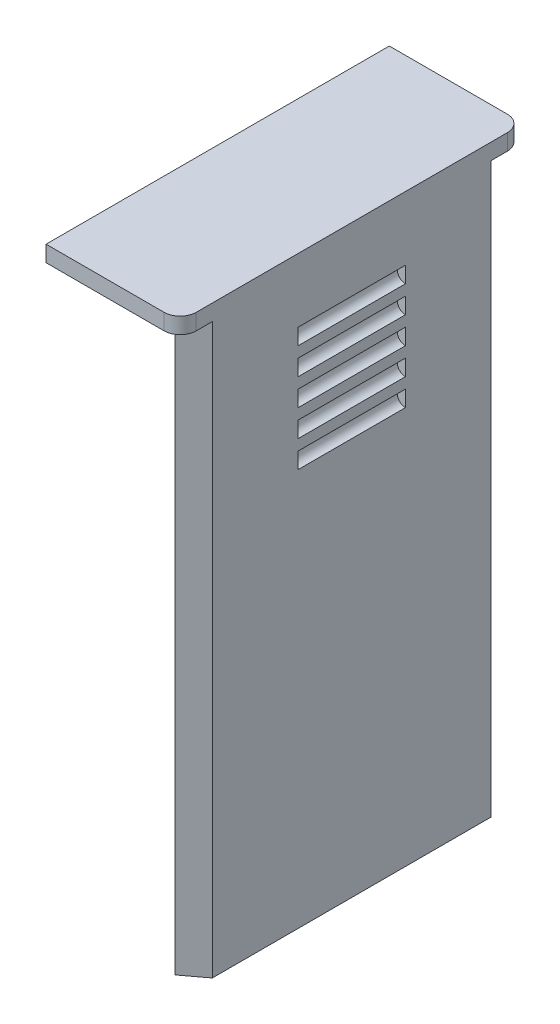
ISO-10303-21;
HEADER;
FILE_DESCRIPTION(('STEP AP214'),'2;1');
FILE_NAME('part.step','',(''),(''),'','','');
FILE_SCHEMA(('AUTOMOTIVE_DESIGN { 1 0 10303 214 1 1 1 1 }'));
ENDSEC;
DATA;
#1=APPLICATION_CONTEXT('core data for automotive mechanical design processes');
#2=APPLICATION_PROTOCOL_DEFINITION('international standard','automotive_design',2000,#1);
#3=PRODUCT_CONTEXT('',#1,'mechanical');
#4=PRODUCT('Part','Part','',(#3));
#5=PRODUCT_RELATED_PRODUCT_CATEGORY('part','',(#4));
#6=PRODUCT_DEFINITION_FORMATION('','',#4);
#7=PRODUCT_DEFINITION_CONTEXT('part definition',#1,'design');
#8=PRODUCT_DEFINITION('design','',#6,#7);
#9=PRODUCT_DEFINITION_SHAPE('','',#8);
#10=(LENGTH_UNIT() NAMED_UNIT(*) SI_UNIT(.MILLI.,.METRE.));
#11=(NAMED_UNIT(*) PLANE_ANGLE_UNIT() SI_UNIT($,.RADIAN.));
#12=(NAMED_UNIT(*) SI_UNIT($,.STERADIAN.) SOLID_ANGLE_UNIT());
#13=UNCERTAINTY_MEASURE_WITH_UNIT(LENGTH_MEASURE(1.E-05),#10,'distance_accuracy_value','');
#14=(GEOMETRIC_REPRESENTATION_CONTEXT(3) GLOBAL_UNCERTAINTY_ASSIGNED_CONTEXT((#13)) GLOBAL_UNIT_ASSIGNED_CONTEXT((#10,
#11,#12)) REPRESENTATION_CONTEXT('',''));
#15=CARTESIAN_POINT('',(0.,0.,0.));
#16=DIRECTION('',(0.,0.,1.));
#17=DIRECTION('',(1.,0.,0.));
#18=AXIS2_PLACEMENT_3D('',#15,#16,#17);
#19=CARTESIAN_POINT('',(-3.45222941321836,109.967949424705,104.41839123638));
#20=DIRECTION('',(1.,0.,0.));
#21=DIRECTION('',(0.,0.,-1.));
#22=AXIS2_PLACEMENT_3D('',#19,#20,#21);
#23=PLANE('',#22);
#24=DIRECTION('',(0.,0.,1.));
#25=VECTOR('',#24,1.);
#26=CARTESIAN_POINT('',(-3.45222941321836,98.017949424705,83.4183912363796));
#27=LINE('',#26,#25);
#28=CARTESIAN_POINT('',(-3.45222941321836,98.017949424705,83.4183912363796));
#29=VERTEX_POINT('',#28);
#30=CARTESIAN_POINT('',(-3.45222941321836,98.017949424705,93.4183912363796));
#31=VERTEX_POINT('',#30);
#32=EDGE_CURVE('E507',#29,#31,#27,.T.);
#33=ORIENTED_EDGE('',*,*,#32,.F.);
#34=DIRECTION('',(0.,-1.,0.));
#35=VECTOR('',#34,1.);
#36=CARTESIAN_POINT('',(-3.45222941321836,109.967949424705,83.4183912363796));
#37=LINE('',#36,#35);
#38=CARTESIAN_POINT('',(-3.45222941321836,96.517949424705,83.4183912363796));
#39=VERTEX_POINT('',#38);
#40=EDGE_CURVE('E205',#29,#39,#37,.T.);
#41=ORIENTED_EDGE('',*,*,#40,.T.);
#42=DIRECTION('',(0.,0.,1.));
#43=VECTOR('',#42,1.);
#44=CARTESIAN_POINT('',(-3.45222941321836,96.517949424705,83.4183912363796));
#45=LINE('',#44,#43);
#46=CARTESIAN_POINT('',(-3.45222941321836,96.517949424705,93.4183912363796));
#47=VERTEX_POINT('',#46);
#48=EDGE_CURVE('E506',#47,#39,#45,.F.);
#49=ORIENTED_EDGE('',*,*,#48,.F.);
#50=DIRECTION('',(0.,-1.,0.));
#51=VECTOR('',#50,1.);
#52=CARTESIAN_POINT('',(-3.45222941321836,109.967949424705,93.4183912363796));
#53=LINE('',#52,#51);
#54=EDGE_CURVE('E511',#31,#47,#53,.T.);
#55=ORIENTED_EDGE('',*,*,#54,.F.);
#56=EDGE_LOOP('',(#33,#41,#49,#55));
#57=FACE_BOUND('',#56,.T.);
#58=DIRECTION('',(0.,0.,1.));
#59=VECTOR('',#58,1.);
#60=CARTESIAN_POINT('',(-3.45222941321836,103.017949424705,83.4183912363796));
#61=LINE('',#60,#59);
#62=CARTESIAN_POINT('',(-3.45222941321836,103.017949424705,83.4183912363796));
#63=VERTEX_POINT('',#62);
#64=CARTESIAN_POINT('',(-3.45222941321836,103.017949424705,93.4183912363796));
#65=VERTEX_POINT('',#64);
#66=EDGE_CURVE('E526',#63,#65,#61,.T.);
#67=ORIENTED_EDGE('',*,*,#66,.F.);
#68=DIRECTION('',(0.,-1.,0.));
#69=VECTOR('',#68,1.);
#70=CARTESIAN_POINT('',(-3.45222941321836,109.967949424705,83.4183912363796));
#71=LINE('',#70,#69);
#72=CARTESIAN_POINT('',(-3.45222941321836,101.517949424705,83.4183912363796));
#73=VERTEX_POINT('',#72);
#74=EDGE_CURVE('E523',#63,#73,#71,.T.);
#75=ORIENTED_EDGE('',*,*,#74,.T.);
#76=DIRECTION('',(0.,0.,1.));
#77=VECTOR('',#76,1.);
#78=CARTESIAN_POINT('',(-3.45222941321836,101.517949424705,83.4183912363796));
#79=LINE('',#78,#77);
#80=CARTESIAN_POINT('',(-3.45222941321836,101.517949424705,93.4183912363796));
#81=VERTEX_POINT('',#80);
#82=EDGE_CURVE('E529',#81,#73,#79,.F.);
#83=ORIENTED_EDGE('',*,*,#82,.F.);
#84=DIRECTION('',(0.,-1.,0.));
#85=VECTOR('',#84,1.);
#86=CARTESIAN_POINT('',(-3.45222941321836,109.967949424705,93.4183912363796));
#87=LINE('',#86,#85);
#88=EDGE_CURVE('E531',#65,#81,#87,.T.);
#89=ORIENTED_EDGE('',*,*,#88,.F.);
#90=EDGE_LOOP('',(#67,#75,#83,#89));
#91=FACE_BOUND('',#90,.T.);
#92=DIRECTION('',(0.,0.,-1.));
#93=VECTOR('',#92,1.);
#94=CARTESIAN_POINT('',(-3.45222941321836,109.967949424705,104.41839123638));
#95=LINE('',#94,#93);
#96=CARTESIAN_POINT('',(-3.45222941321836,109.967949424705,75.4183912363796));
#97=VERTEX_POINT('',#96);
#98=CARTESIAN_POINT('',(-3.45222941321836,109.967949424705,73.9183912363796));
#99=VERTEX_POINT('',#98);
#100=EDGE_CURVE('E226',#97,#99,#95,.T.);
#101=ORIENTED_EDGE('',*,*,#100,.T.);
#102=DIRECTION('',(0.,1.,0.));
#103=VECTOR('',#102,1.);
#104=CARTESIAN_POINT('',(-3.45222941321836,109.967949424705,73.9183912363796));
#105=LINE('',#104,#103);
#106=CARTESIAN_POINT('',(-3.45222941321836,111.467949424705,73.9183912363796));
#107=VERTEX_POINT('',#106);
#108=EDGE_CURVE('E373',#99,#107,#105,.T.);
#109=ORIENTED_EDGE('',*,*,#108,.T.);
#110=DIRECTION('',(0.,0.,-1.));
#111=VECTOR('',#110,1.);
#112=CARTESIAN_POINT('',(-3.45222941321836,111.467949424705,104.41839123638));
#113=LINE('',#112,#111);
#114=CARTESIAN_POINT('',(-3.45222941321836,111.467949424705,102.91839123638));
#115=VERTEX_POINT('',#114);
#116=EDGE_CURVE('E252',#115,#107,#113,.T.);
#117=ORIENTED_EDGE('',*,*,#116,.F.);
#118=DIRECTION('',(0.,1.,0.));
#119=VECTOR('',#118,1.);
#120=CARTESIAN_POINT('',(-3.45222941321836,109.967949424705,102.91839123638));
#121=LINE('',#120,#119);
#122=CARTESIAN_POINT('',(-3.45222941321836,109.967949424705,102.91839123638));
#123=VERTEX_POINT('',#122);
#124=EDGE_CURVE('E221',#115,#123,#121,.F.);
#125=ORIENTED_EDGE('',*,*,#124,.T.);
#126=CARTESIAN_POINT('',(-3.45222941321836,109.967949424705,101.41839123638));
#127=VERTEX_POINT('',#126);
#128=EDGE_CURVE('E222',#123,#127,#95,.T.);
#129=ORIENTED_EDGE('',*,*,#128,.T.);
#130=DIRECTION('',(0.,1.,0.));
#131=VECTOR('',#130,1.);
#132=CARTESIAN_POINT('',(-3.45222941321836,56.967949424705,101.41839123638));
#133=LINE('',#132,#131);
#134=CARTESIAN_POINT('',(-3.45222941321836,56.967949424705,101.41839123638));
#135=VERTEX_POINT('',#134);
#136=EDGE_CURVE('E249',#135,#127,#133,.T.);
#137=ORIENTED_EDGE('',*,*,#136,.F.);
#138=DIRECTION('',(0.,0.,1.));
#139=VECTOR('',#138,1.);
#140=CARTESIAN_POINT('',(-3.45222941321836,56.967949424705,75.4183912363796));
#141=LINE('',#140,#139);
#142=CARTESIAN_POINT('',(-3.45222941321836,56.967949424705,75.4183912363796));
#143=VERTEX_POINT('',#142);
#144=EDGE_CURVE('E259',#143,#135,#141,.T.);
#145=ORIENTED_EDGE('',*,*,#144,.F.);
#146=DIRECTION('',(0.,1.,0.));
#147=VECTOR('',#146,1.);
#148=CARTESIAN_POINT('',(-3.45222941321836,56.967949424705,75.4183912363796));
#149=LINE('',#148,#147);
#150=EDGE_CURVE('E261',#143,#97,#149,.T.);
#151=ORIENTED_EDGE('',*,*,#150,.T.);
#152=EDGE_LOOP('',(#101,#109,#117,#125,#129,#137,#145,#151));
#153=FACE_BOUND('',#152,.T.);
#154=DIRECTION('',(0.,0.,1.));
#155=VECTOR('',#154,1.);
#156=CARTESIAN_POINT('',(-3.45222941321836,105.517949424705,83.4183912363796));
#157=LINE('',#156,#155);
#158=CARTESIAN_POINT('',(-3.45222941321836,105.517949424705,83.4183912363796));
#159=VERTEX_POINT('',#158);
#160=CARTESIAN_POINT('',(-3.45222941321836,105.517949424705,93.4183912363796));
#161=VERTEX_POINT('',#160);
#162=EDGE_CURVE('E536',#159,#161,#157,.T.);
#163=ORIENTED_EDGE('',*,*,#162,.F.);
#164=DIRECTION('',(0.,-1.,0.));
#165=VECTOR('',#164,1.);
#166=CARTESIAN_POINT('',(-3.45222941321836,109.967949424705,83.4183912363796));
#167=LINE('',#166,#165);
#168=CARTESIAN_POINT('',(-3.45222941321836,104.017949424705,83.4183912363796));
#169=VERTEX_POINT('',#168);
#170=EDGE_CURVE('E533',#159,#169,#167,.T.);
#171=ORIENTED_EDGE('',*,*,#170,.T.);
#172=DIRECTION('',(0.,0.,1.));
#173=VECTOR('',#172,1.);
#174=CARTESIAN_POINT('',(-3.45222941321836,104.017949424705,83.4183912363796));
#175=LINE('',#174,#173);
#176=CARTESIAN_POINT('',(-3.45222941321836,104.017949424705,93.4183912363796));
#177=VERTEX_POINT('',#176);
#178=EDGE_CURVE('E405',#177,#169,#175,.F.);
#179=ORIENTED_EDGE('',*,*,#178,.F.);
#180=DIRECTION('',(0.,-1.,0.));
#181=VECTOR('',#180,1.);
#182=CARTESIAN_POINT('',(-3.45222941321836,109.967949424705,93.4183912363796));
#183=LINE('',#182,#181);
#184=EDGE_CURVE('E402',#161,#177,#183,.T.);
#185=ORIENTED_EDGE('',*,*,#184,.F.);
#186=EDGE_LOOP('',(#163,#171,#179,#185));
#187=FACE_BOUND('',#186,.T.);
#188=DIRECTION('',(0.,0.,1.));
#189=VECTOR('',#188,1.);
#190=CARTESIAN_POINT('',(-3.45222941321836,100.517949424705,83.4183912363796));
#191=LINE('',#190,#189);
#192=CARTESIAN_POINT('',(-3.45222941321836,100.517949424705,83.4183912363796));
#193=VERTEX_POINT('',#192);
#194=CARTESIAN_POINT('',(-3.45222941321836,100.517949424705,93.4183912363796));
#195=VERTEX_POINT('',#194);
#196=EDGE_CURVE('E516',#193,#195,#191,.T.);
#197=ORIENTED_EDGE('',*,*,#196,.F.);
#198=DIRECTION('',(0.,-1.,0.));
#199=VECTOR('',#198,1.);
#200=CARTESIAN_POINT('',(-3.45222941321836,109.967949424705,83.4183912363796));
#201=LINE('',#200,#199);
#202=CARTESIAN_POINT('',(-3.45222941321836,99.017949424705,83.4183912363796));
#203=VERTEX_POINT('',#202);
#204=EDGE_CURVE('E513',#193,#203,#201,.T.);
#205=ORIENTED_EDGE('',*,*,#204,.T.);
#206=DIRECTION('',(0.,0.,1.));
#207=VECTOR('',#206,1.);
#208=CARTESIAN_POINT('',(-3.45222941321836,99.017949424705,83.4183912363796));
#209=LINE('',#208,#207);
#210=CARTESIAN_POINT('',(-3.45222941321836,99.017949424705,93.4183912363796));
#211=VERTEX_POINT('',#210);
#212=EDGE_CURVE('E519',#211,#203,#209,.F.);
#213=ORIENTED_EDGE('',*,*,#212,.F.);
#214=DIRECTION('',(0.,-1.,0.));
#215=VECTOR('',#214,1.);
#216=CARTESIAN_POINT('',(-3.45222941321836,109.967949424705,93.4183912363796));
#217=LINE('',#216,#215);
#218=EDGE_CURVE('E521',#195,#211,#217,.T.);
#219=ORIENTED_EDGE('',*,*,#218,.F.);
#220=EDGE_LOOP('',(#197,#205,#213,#219));
#221=FACE_BOUND('',#220,.T.);
#222=DIRECTION('',(0.,0.,1.));
#223=VECTOR('',#222,1.);
#224=CARTESIAN_POINT('',(-3.45222941321836,95.517949424705,83.4183912363796));
#225=LINE('',#224,#223);
#226=CARTESIAN_POINT('',(-3.45222941321836,95.517949424705,83.4183912363796));
#227=VERTEX_POINT('',#226);
#228=CARTESIAN_POINT('',(-3.45222941321836,95.517949424705,93.4183912363796));
#229=VERTEX_POINT('',#228);
#230=EDGE_CURVE('E211',#227,#229,#225,.T.);
#231=ORIENTED_EDGE('',*,*,#230,.F.);
#232=DIRECTION('',(0.,-1.,0.));
#233=VECTOR('',#232,1.);
#234=CARTESIAN_POINT('',(-3.45222941321836,109.967949424705,83.4183912363796));
#235=LINE('',#234,#233);
#236=CARTESIAN_POINT('',(-3.45222941321836,94.017949424705,83.4183912363796));
#237=VERTEX_POINT('',#236);
#238=EDGE_CURVE('E215',#227,#237,#235,.T.);
#239=ORIENTED_EDGE('',*,*,#238,.T.);
#240=DIRECTION('',(0.,0.,1.));
#241=VECTOR('',#240,1.);
#242=CARTESIAN_POINT('',(-3.45222941321836,94.017949424705,83.4183912363796));
#243=LINE('',#242,#241);
#244=CARTESIAN_POINT('',(-3.45222941321836,94.017949424705,93.4183912363796));
#245=VERTEX_POINT('',#244);
#246=EDGE_CURVE('E204',#245,#237,#243,.F.);
#247=ORIENTED_EDGE('',*,*,#246,.F.);
#248=DIRECTION('',(0.,-1.,0.));
#249=VECTOR('',#248,1.);
#250=CARTESIAN_POINT('',(-3.45222941321836,109.967949424705,93.4183912363796));
#251=LINE('',#250,#249);
#252=EDGE_CURVE('E196',#229,#245,#251,.T.);
#253=ORIENTED_EDGE('',*,*,#252,.F.);
#254=EDGE_LOOP('',(#231,#239,#247,#253));
#255=FACE_BOUND('',#254,.T.);
#256=ADVANCED_FACE('F33',(#57,#91,#153,#187,#221,#255),#23,.T.);
#257=CARTESIAN_POINT('',(0.,109.967949424705,0.));
#258=DIRECTION('',(0.,1.,0.));
#259=DIRECTION('',(0.,0.,1.));
#260=AXIS2_PLACEMENT_3D('',#257,#258,#259);
#261=PLANE('',#260);
#262=DIRECTION('',(-1.,0.,0.));
#263=VECTOR('',#262,1.);
#264=CARTESIAN_POINT('',(-3.45222941321836,109.967949424705,72.4183912363796));
#265=LINE('',#264,#263);
#266=CARTESIAN_POINT('',(-4.95222941321836,109.967949424705,72.4183912363796));
#267=VERTEX_POINT('',#266);
#268=CARTESIAN_POINT('',(-15.9522294132184,109.967949424705,72.4183912363796));
#269=VERTEX_POINT('',#268);
#270=EDGE_CURVE('E225',#267,#269,#265,.T.);
#271=ORIENTED_EDGE('',*,*,#270,.F.);
#272=CARTESIAN_POINT('',(-4.95222941321836,109.967949424705,73.9183912363796));
#273=DIRECTION('',(0.,1.,0.));
#274=DIRECTION('',(0.,0.,1.));
#275=AXIS2_PLACEMENT_3D('',#272,#273,#274);
#276=CIRCLE('',#275,1.5);
#277=EDGE_CURVE('E41',#267,#99,#276,.F.);
#278=ORIENTED_EDGE('',*,*,#277,.T.);
#279=ORIENTED_EDGE('',*,*,#100,.F.);
#280=DIRECTION('',(0.799999999999999,0.,0.600000000000001));
#281=VECTOR('',#280,1.);
#282=CARTESIAN_POINT('',(-3.45222941321836,109.967949424705,75.4183912363796));
#283=LINE('',#282,#281);
#284=CARTESIAN_POINT('',(-5.45222941321836,109.967949424705,73.9183912363796));
#285=VERTEX_POINT('',#284);
#286=EDGE_CURVE('E255',#285,#97,#283,.T.);
#287=ORIENTED_EDGE('',*,*,#286,.F.);
#288=DIRECTION('',(0.,0.,-1.));
#289=VECTOR('',#288,1.);
#290=CARTESIAN_POINT('',(-5.45222941321836,109.967949424705,102.91839123638));
#291=LINE('',#290,#289);
#292=CARTESIAN_POINT('',(-5.45222941321836,109.967949424705,80.9183912363796));
#293=VERTEX_POINT('',#292);
#294=EDGE_CURVE('E245',#293,#285,#291,.T.);
#295=ORIENTED_EDGE('',*,*,#294,.F.);
#296=DIRECTION('',(1.,0.,0.));
#297=VECTOR('',#296,1.);
#298=CARTESIAN_POINT('',(-5.45222941321835,109.967949424705,80.9183912363796));
#299=LINE('',#298,#297);
#300=CARTESIAN_POINT('',(-6.45222941321835,109.967949424705,80.9183912363796));
#301=VERTEX_POINT('',#300);
#302=EDGE_CURVE('E296',#301,#293,#299,.T.);
#303=ORIENTED_EDGE('',*,*,#302,.F.);
#304=DIRECTION('',(0.,0.,-1.));
#305=VECTOR('',#304,1.);
#306=CARTESIAN_POINT('',(-6.45222941321835,109.967949424705,95.9183912363796));
#307=LINE('',#306,#305);
#308=CARTESIAN_POINT('',(-6.45222941321835,109.967949424705,95.9183912363796));
#309=VERTEX_POINT('',#308);
#310=EDGE_CURVE('E300',#309,#301,#307,.T.);
#311=ORIENTED_EDGE('',*,*,#310,.F.);
#312=DIRECTION('',(-1.,0.,0.));
#313=VECTOR('',#312,1.);
#314=CARTESIAN_POINT('',(-5.45222941321835,109.967949424705,95.9183912363796));
#315=LINE('',#314,#313);
#316=CARTESIAN_POINT('',(-5.45222941321836,109.967949424705,95.9183912363796));
#317=VERTEX_POINT('',#316);
#318=EDGE_CURVE('E303',#317,#309,#315,.T.);
#319=ORIENTED_EDGE('',*,*,#318,.F.);
#320=CARTESIAN_POINT('',(-5.45222941321836,109.967949424705,102.91839123638));
#321=VERTEX_POINT('',#320);
#322=EDGE_CURVE('E260',#321,#317,#291,.T.);
#323=ORIENTED_EDGE('',*,*,#322,.F.);
#324=DIRECTION('',(-0.799999999999999,0.,0.600000000000001));
#325=VECTOR('',#324,1.);
#326=CARTESIAN_POINT('',(-3.45222941321836,109.967949424705,101.41839123638));
#327=LINE('',#326,#325);
#328=EDGE_CURVE('E242',#127,#321,#327,.T.);
#329=ORIENTED_EDGE('',*,*,#328,.F.);
#330=ORIENTED_EDGE('',*,*,#128,.F.);
#331=CARTESIAN_POINT('',(-4.95222941321836,109.967949424705,102.91839123638));
#332=DIRECTION('',(0.,1.,0.));
#333=DIRECTION('',(0.,0.,1.));
#334=AXIS2_PLACEMENT_3D('',#331,#332,#333);
#335=CIRCLE('',#334,1.5);
#336=CARTESIAN_POINT('',(-4.95222941321836,109.967949424705,104.41839123638));
#337=VERTEX_POINT('',#336);
#338=EDGE_CURVE('E48',#123,#337,#335,.F.);
#339=ORIENTED_EDGE('',*,*,#338,.T.);
#340=DIRECTION('',(1.,0.,0.));
#341=VECTOR('',#340,1.);
#342=CARTESIAN_POINT('',(-15.9522294132184,109.967949424705,104.41839123638));
#343=LINE('',#342,#341);
#344=CARTESIAN_POINT('',(-15.9522294132184,109.967949424705,104.41839123638));
#345=VERTEX_POINT('',#344);
#346=EDGE_CURVE('E391',#345,#337,#343,.T.);
#347=ORIENTED_EDGE('',*,*,#346,.F.);
#348=DIRECTION('',(0.,0.,1.));
#349=VECTOR('',#348,1.);
#350=CARTESIAN_POINT('',(-15.9522294132184,109.967949424705,72.4183912363796));
#351=LINE('',#350,#349);
#352=EDGE_CURVE('E409',#269,#345,#351,.T.);
#353=ORIENTED_EDGE('',*,*,#352,.F.);
#354=EDGE_LOOP('',(#271,#278,#279,#287,#295,#303,#311,#319,#323,#329,#330,#339,#347,#353));
#355=FACE_BOUND('',#354,.T.);
#356=ADVANCED_FACE('F351',(#355),#261,.F.);
#357=CARTESIAN_POINT('',(-5.45222941321836,56.967949424705,102.91839123638));
#358=DIRECTION('',(1.,0.,0.));
#359=DIRECTION('',(0.,0.,-1.));
#360=AXIS2_PLACEMENT_3D('',#357,#358,#359);
#361=PLANE('',#360);
#362=DIRECTION('',(0.,1.,0.));
#363=VECTOR('',#362,1.);
#364=CARTESIAN_POINT('',(-5.45222941321835,89.967949424705,95.9183912363796));
#365=LINE('',#364,#363);
#366=CARTESIAN_POINT('',(-5.45222941321835,89.967949424705,95.9183912363796));
#367=VERTEX_POINT('',#366);
#368=EDGE_CURVE('E246',#367,#317,#365,.T.);
#369=ORIENTED_EDGE('',*,*,#368,.F.);
#370=DIRECTION('',(0.,0.,1.));
#371=VECTOR('',#370,1.);
#372=CARTESIAN_POINT('',(-5.45222941321835,89.967949424705,95.9183912363796));
#373=LINE('',#372,#371);
#374=CARTESIAN_POINT('',(-5.45222941321836,89.967949424705,80.9183912363796));
#375=VERTEX_POINT('',#374);
#376=EDGE_CURVE('E299',#375,#367,#373,.T.);
#377=ORIENTED_EDGE('',*,*,#376,.F.);
#378=DIRECTION('',(0.,1.,0.));
#379=VECTOR('',#378,1.);
#380=CARTESIAN_POINT('',(-5.45222941321835,89.967949424705,80.9183912363796));
#381=LINE('',#380,#379);
#382=EDGE_CURVE('E293',#375,#293,#381,.T.);
#383=ORIENTED_EDGE('',*,*,#382,.T.);
#384=ORIENTED_EDGE('',*,*,#294,.T.);
#385=DIRECTION('',(0.,1.,0.));
#386=VECTOR('',#385,1.);
#387=CARTESIAN_POINT('',(-5.45222941321836,56.967949424705,73.9183912363796));
#388=LINE('',#387,#386);
#389=CARTESIAN_POINT('',(-5.45222941321836,56.967949424705,73.9183912363796));
#390=VERTEX_POINT('',#389);
#391=EDGE_CURVE('E266',#390,#285,#388,.T.);
#392=ORIENTED_EDGE('',*,*,#391,.F.);
#393=DIRECTION('',(0.,0.,-1.));
#394=VECTOR('',#393,1.);
#395=CARTESIAN_POINT('',(-5.45222941321836,56.967949424705,102.91839123638));
#396=LINE('',#395,#394);
#397=CARTESIAN_POINT('',(-5.45222941321836,56.967949424705,102.91839123638));
#398=VERTEX_POINT('',#397);
#399=EDGE_CURVE('E277',#398,#390,#396,.T.);
#400=ORIENTED_EDGE('',*,*,#399,.F.);
#401=DIRECTION('',(0.,1.,0.));
#402=VECTOR('',#401,1.);
#403=CARTESIAN_POINT('',(-5.45222941321836,56.967949424705,102.91839123638));
#404=LINE('',#403,#402);
#405=EDGE_CURVE('E231',#398,#321,#404,.T.);
#406=ORIENTED_EDGE('',*,*,#405,.T.);
#407=ORIENTED_EDGE('',*,*,#322,.T.);
#408=EDGE_LOOP('',(#369,#377,#383,#384,#392,#400,#406,#407));
#409=FACE_BOUND('',#408,.T.);
#410=ADVANCED_FACE('F357',(#409),#361,.F.);
#411=CARTESIAN_POINT('',(-15.9522294132184,109.967949424705,104.41839123638));
#412=DIRECTION('',(0.,0.,1.));
#413=DIRECTION('',(1.,0.,0.));
#414=AXIS2_PLACEMENT_3D('',#411,#412,#413);
#415=PLANE('',#414);
#416=ORIENTED_EDGE('',*,*,#346,.T.);
#417=DIRECTION('',(0.,1.,0.));
#418=VECTOR('',#417,1.);
#419=CARTESIAN_POINT('',(-4.95222941321836,109.967949424705,104.41839123638));
#420=LINE('',#419,#418);
#421=CARTESIAN_POINT('',(-4.95222941321836,111.467949424705,104.41839123638));
#422=VERTEX_POINT('',#421);
#423=EDGE_CURVE('E11',#337,#422,#420,.T.);
#424=ORIENTED_EDGE('',*,*,#423,.T.);
#425=DIRECTION('',(1.,0.,0.));
#426=VECTOR('',#425,1.);
#427=CARTESIAN_POINT('',(-15.9522294132184,111.467949424705,104.41839123638));
#428=LINE('',#427,#426);
#429=CARTESIAN_POINT('',(-15.9522294132184,111.467949424705,104.41839123638));
#430=VERTEX_POINT('',#429);
#431=EDGE_CURVE('E239',#430,#422,#428,.T.);
#432=ORIENTED_EDGE('',*,*,#431,.F.);
#433=DIRECTION('',(0.,1.,0.));
#434=VECTOR('',#433,1.);
#435=CARTESIAN_POINT('',(-15.9522294132184,109.967949424705,104.41839123638));
#436=LINE('',#435,#434);
#437=EDGE_CURVE('E401',#345,#430,#436,.T.);
#438=ORIENTED_EDGE('',*,*,#437,.F.);
#439=EDGE_LOOP('',(#416,#424,#432,#438));
#440=FACE_BOUND('',#439,.T.);
#441=ADVANCED_FACE('F390',(#440),#415,.T.);
#442=CARTESIAN_POINT('',(-15.9522294132184,109.967949424705,72.4183912363796));
#443=DIRECTION('',(-1.,0.,0.));
#444=DIRECTION('',(0.,0.,1.));
#445=AXIS2_PLACEMENT_3D('',#442,#443,#444);
#446=PLANE('',#445);
#447=DIRECTION('',(0.,0.,1.));
#448=VECTOR('',#447,1.);
#449=CARTESIAN_POINT('',(-15.9522294132184,111.467949424705,72.4183912363796));
#450=LINE('',#449,#448);
#451=CARTESIAN_POINT('',(-15.9522294132184,111.467949424705,72.4183912363796));
#452=VERTEX_POINT('',#451);
#453=EDGE_CURVE('E396',#452,#430,#450,.T.);
#454=ORIENTED_EDGE('',*,*,#453,.F.);
#455=DIRECTION('',(0.,1.,0.));
#456=VECTOR('',#455,1.);
#457=CARTESIAN_POINT('',(-15.9522294132184,109.967949424705,72.4183912363796));
#458=LINE('',#457,#456);
#459=EDGE_CURVE('E240',#269,#452,#458,.T.);
#460=ORIENTED_EDGE('',*,*,#459,.F.);
#461=ORIENTED_EDGE('',*,*,#352,.T.);
#462=ORIENTED_EDGE('',*,*,#437,.T.);
#463=EDGE_LOOP('',(#454,#460,#461,#462));
#464=FACE_BOUND('',#463,.T.);
#465=ADVANCED_FACE('F413',(#464),#446,.T.);
#466=CARTESIAN_POINT('',(-3.45222941321836,109.967949424705,72.4183912363796));
#467=DIRECTION('',(0.,0.,-1.));
#468=DIRECTION('',(-1.,0.,0.));
#469=AXIS2_PLACEMENT_3D('',#466,#467,#468);
#470=PLANE('',#469);
#471=DIRECTION('',(-1.,0.,0.));
#472=VECTOR('',#471,1.);
#473=CARTESIAN_POINT('',(-3.45222941321836,111.467949424705,72.4183912363796));
#474=LINE('',#473,#472);
#475=CARTESIAN_POINT('',(-4.95222941321836,111.467949424705,72.4183912363796));
#476=VERTEX_POINT('',#475);
#477=EDGE_CURVE('E398',#476,#452,#474,.T.);
#478=ORIENTED_EDGE('',*,*,#477,.F.);
#479=DIRECTION('',(0.,1.,0.));
#480=VECTOR('',#479,1.);
#481=CARTESIAN_POINT('',(-4.95222941321836,109.967949424705,72.4183912363796));
#482=LINE('',#481,#480);
#483=EDGE_CURVE('E56',#476,#267,#482,.F.);
#484=ORIENTED_EDGE('',*,*,#483,.T.);
#485=ORIENTED_EDGE('',*,*,#270,.T.);
#486=ORIENTED_EDGE('',*,*,#459,.T.);
#487=EDGE_LOOP('',(#478,#484,#485,#486));
#488=FACE_BOUND('',#487,.T.);
#489=ADVANCED_FACE('F362',(#488),#470,.T.);
#490=CARTESIAN_POINT('',(0.,111.467949424705,0.));
#491=DIRECTION('',(0.,1.,0.));
#492=DIRECTION('',(0.,0.,1.));
#493=AXIS2_PLACEMENT_3D('',#490,#491,#492);
#494=PLANE('',#493);
#495=ORIENTED_EDGE('',*,*,#116,.T.);
#496=CARTESIAN_POINT('',(-4.95222941321836,111.467949424705,73.9183912363796));
#497=DIRECTION('',(0.,1.,0.));
#498=DIRECTION('',(0.,0.,1.));
#499=AXIS2_PLACEMENT_3D('',#496,#497,#498);
#500=CIRCLE('',#499,1.5);
#501=EDGE_CURVE('E377',#107,#476,#500,.T.);
#502=ORIENTED_EDGE('',*,*,#501,.T.);
#503=ORIENTED_EDGE('',*,*,#477,.T.);
#504=ORIENTED_EDGE('',*,*,#453,.T.);
#505=ORIENTED_EDGE('',*,*,#431,.T.);
#506=CARTESIAN_POINT('',(-4.95222941321836,111.467949424705,102.91839123638));
#507=DIRECTION('',(0.,1.,0.));
#508=DIRECTION('',(0.,0.,1.));
#509=AXIS2_PLACEMENT_3D('',#506,#507,#508);
#510=CIRCLE('',#509,1.5);
#511=EDGE_CURVE('E379',#422,#115,#510,.T.);
#512=ORIENTED_EDGE('',*,*,#511,.T.);
#513=EDGE_LOOP('',(#495,#502,#503,#504,#505,#512));
#514=FACE_BOUND('',#513,.T.);
#515=ADVANCED_FACE('F394',(#514),#494,.T.);
#516=CARTESIAN_POINT('',(-3.45222941321836,56.967949424705,101.41839123638));
#517=DIRECTION('',(-0.600000000000001,0.,-0.799999999999999));
#518=DIRECTION('',(-0.799999999999999,0.,0.600000000000001));
#519=AXIS2_PLACEMENT_3D('',#516,#517,#518);
#520=PLANE('',#519);
#521=ORIENTED_EDGE('',*,*,#328,.T.);
#522=ORIENTED_EDGE('',*,*,#405,.F.);
#523=DIRECTION('',(-0.799999999999999,0.,0.600000000000001));
#524=VECTOR('',#523,1.);
#525=CARTESIAN_POINT('',(-3.45222941321836,56.967949424705,101.41839123638));
#526=LINE('',#525,#524);
#527=EDGE_CURVE('E280',#135,#398,#526,.T.);
#528=ORIENTED_EDGE('',*,*,#527,.F.);
#529=ORIENTED_EDGE('',*,*,#136,.T.);
#530=EDGE_LOOP('',(#521,#522,#528,#529));
#531=FACE_BOUND('',#530,.T.);
#532=ADVANCED_FACE('F418',(#531),#520,.F.);
#533=CARTESIAN_POINT('',(-3.45222941321836,56.967949424705,75.4183912363796));
#534=DIRECTION('',(-0.600000000000001,0.,0.799999999999999));
#535=DIRECTION('',(0.799999999999999,0.,0.600000000000001));
#536=AXIS2_PLACEMENT_3D('',#533,#534,#535);
#537=PLANE('',#536);
#538=ORIENTED_EDGE('',*,*,#286,.T.);
#539=ORIENTED_EDGE('',*,*,#150,.F.);
#540=DIRECTION('',(0.799999999999999,0.,0.600000000000001));
#541=VECTOR('',#540,1.);
#542=CARTESIAN_POINT('',(-3.45222941321836,56.967949424705,75.4183912363796));
#543=LINE('',#542,#541);
#544=EDGE_CURVE('E273',#390,#143,#543,.T.);
#545=ORIENTED_EDGE('',*,*,#544,.F.);
#546=ORIENTED_EDGE('',*,*,#391,.T.);
#547=EDGE_LOOP('',(#538,#539,#545,#546));
#548=FACE_BOUND('',#547,.T.);
#549=ADVANCED_FACE('F427',(#548),#537,.F.);
#550=CARTESIAN_POINT('',(0.,56.967949424705,0.));
#551=DIRECTION('',(0.,-1.,0.));
#552=DIRECTION('',(0.,0.,-1.));
#553=AXIS2_PLACEMENT_3D('',#550,#551,#552);
#554=PLANE('',#553);
#555=ORIENTED_EDGE('',*,*,#144,.T.);
#556=ORIENTED_EDGE('',*,*,#527,.T.);
#557=ORIENTED_EDGE('',*,*,#399,.T.);
#558=ORIENTED_EDGE('',*,*,#544,.T.);
#559=EDGE_LOOP('',(#555,#556,#557,#558));
#560=FACE_BOUND('',#559,.T.);
#561=ADVANCED_FACE('F434',(#560),#554,.T.);
#562=CARTESIAN_POINT('',(-5.45222941321835,89.967949424705,95.9183912363796));
#563=DIRECTION('',(0.,0.,-1.));
#564=DIRECTION('',(-1.,0.,0.));
#565=AXIS2_PLACEMENT_3D('',#562,#563,#564);
#566=PLANE('',#565);
#567=ORIENTED_EDGE('',*,*,#318,.T.);
#568=DIRECTION('',(0.,1.,0.));
#569=VECTOR('',#568,1.);
#570=CARTESIAN_POINT('',(-6.45222941321835,89.967949424705,95.9183912363796));
#571=LINE('',#570,#569);
#572=CARTESIAN_POINT('',(-6.45222941321835,89.967949424705,95.9183912363796));
#573=VERTEX_POINT('',#572);
#574=EDGE_CURVE('E287',#573,#309,#571,.T.);
#575=ORIENTED_EDGE('',*,*,#574,.F.);
#576=DIRECTION('',(-1.,0.,0.));
#577=VECTOR('',#576,1.);
#578=CARTESIAN_POINT('',(-5.45222941321835,89.967949424705,95.9183912363796));
#579=LINE('',#578,#577);
#580=EDGE_CURVE('E311',#367,#573,#579,.T.);
#581=ORIENTED_EDGE('',*,*,#580,.F.);
#582=ORIENTED_EDGE('',*,*,#368,.T.);
#583=EDGE_LOOP('',(#567,#575,#581,#582));
#584=FACE_BOUND('',#583,.T.);
#585=ADVANCED_FACE('F437',(#584),#566,.F.);
#586=CARTESIAN_POINT('',(-6.45222941321835,89.967949424705,95.9183912363796));
#587=DIRECTION('',(1.,0.,0.));
#588=DIRECTION('',(0.,0.,-1.));
#589=AXIS2_PLACEMENT_3D('',#586,#587,#588);
#590=PLANE('',#589);
#591=ORIENTED_EDGE('',*,*,#310,.T.);
#592=DIRECTION('',(0.,1.,0.));
#593=VECTOR('',#592,1.);
#594=CARTESIAN_POINT('',(-6.45222941321835,89.967949424705,80.9183912363796));
#595=LINE('',#594,#593);
#596=CARTESIAN_POINT('',(-6.45222941321835,89.967949424705,80.9183912363796));
#597=VERTEX_POINT('',#596);
#598=EDGE_CURVE('E290',#597,#301,#595,.T.);
#599=ORIENTED_EDGE('',*,*,#598,.F.);
#600=DIRECTION('',(0.,0.,-1.));
#601=VECTOR('',#600,1.);
#602=CARTESIAN_POINT('',(-6.45222941321835,89.967949424705,95.9183912363796));
#603=LINE('',#602,#601);
#604=EDGE_CURVE('E309',#573,#597,#603,.T.);
#605=ORIENTED_EDGE('',*,*,#604,.F.);
#606=ORIENTED_EDGE('',*,*,#574,.T.);
#607=EDGE_LOOP('',(#591,#599,#605,#606));
#608=FACE_BOUND('',#607,.T.);
#609=ADVANCED_FACE('F440',(#608),#590,.F.);
#610=CARTESIAN_POINT('',(-5.45222941321835,89.967949424705,80.9183912363796));
#611=DIRECTION('',(0.,0.,1.));
#612=DIRECTION('',(1.,0.,0.));
#613=AXIS2_PLACEMENT_3D('',#610,#611,#612);
#614=PLANE('',#613);
#615=ORIENTED_EDGE('',*,*,#302,.T.);
#616=ORIENTED_EDGE('',*,*,#382,.F.);
#617=DIRECTION('',(1.,0.,0.));
#618=VECTOR('',#617,1.);
#619=CARTESIAN_POINT('',(-5.45222941321835,89.967949424705,80.9183912363796));
#620=LINE('',#619,#618);
#621=EDGE_CURVE('E295',#597,#375,#620,.T.);
#622=ORIENTED_EDGE('',*,*,#621,.F.);
#623=ORIENTED_EDGE('',*,*,#598,.T.);
#624=EDGE_LOOP('',(#615,#616,#622,#623));
#625=FACE_BOUND('',#624,.T.);
#626=ADVANCED_FACE('F444',(#625),#614,.F.);
#627=CARTESIAN_POINT('',(0.,89.967949424705,0.));
#628=DIRECTION('',(0.,1.,0.));
#629=DIRECTION('',(0.,0.,1.));
#630=AXIS2_PLACEMENT_3D('',#627,#628,#629);
#631=PLANE('',#630);
#632=ORIENTED_EDGE('',*,*,#376,.T.);
#633=ORIENTED_EDGE('',*,*,#580,.T.);
#634=ORIENTED_EDGE('',*,*,#604,.T.);
#635=ORIENTED_EDGE('',*,*,#621,.T.);
#636=EDGE_LOOP('',(#632,#633,#634,#635));
#637=FACE_BOUND('',#636,.T.);
#638=ADVANCED_FACE('F448',(#637),#631,.F.);
#639=CARTESIAN_POINT('',(-3.45222941321836,104.767949424705,83.4183912363796));
#640=DIRECTION('',(0.,0.,1.));
#641=DIRECTION('',(1.,0.,0.));
#642=AXIS2_PLACEMENT_3D('',#639,#640,#641);
#643=CYLINDRICAL_SURFACE('',#642,0.749999999999999);
#644=ORIENTED_EDGE('',*,*,#162,.T.);
#645=CARTESIAN_POINT('',(-3.45222941321836,104.767949424705,93.4183912363796));
#646=DIRECTION('',(0.,0.,1.));
#647=DIRECTION('',(1.,0.,0.));
#648=AXIS2_PLACEMENT_3D('',#645,#646,#647);
#649=CIRCLE('',#648,0.749999999999999);
#650=EDGE_CURVE('E315',#161,#177,#649,.T.);
#651=ORIENTED_EDGE('',*,*,#650,.T.);
#652=ORIENTED_EDGE('',*,*,#178,.T.);
#653=CARTESIAN_POINT('',(-3.45222941321836,104.767949424705,83.4183912363796));
#654=DIRECTION('',(0.,0.,1.));
#655=DIRECTION('',(1.,0.,0.));
#656=AXIS2_PLACEMENT_3D('',#653,#654,#655);
#657=CIRCLE('',#656,0.749999999999999);
#658=EDGE_CURVE('E306',#159,#169,#657,.T.);
#659=ORIENTED_EDGE('',*,*,#658,.F.);
#660=EDGE_LOOP('',(#644,#651,#652,#659));
#661=FACE_BOUND('',#660,.T.);
#662=ADVANCED_FACE('F452',(#661),#643,.F.);
#663=CARTESIAN_POINT('',(-3.45222941321836,104.767949424705,83.4183912363796));
#664=DIRECTION('',(0.,0.,1.));
#665=DIRECTION('',(1.,0.,0.));
#666=AXIS2_PLACEMENT_3D('',#663,#664,#665);
#667=PLANE('',#666);
#668=ORIENTED_EDGE('',*,*,#658,.T.);
#669=ORIENTED_EDGE('',*,*,#170,.F.);
#670=EDGE_LOOP('',(#668,#669));
#671=FACE_BOUND('',#670,.T.);
#672=ADVANCED_FACE('F456',(#671),#667,.T.);
#673=CARTESIAN_POINT('',(-3.45222941321836,104.767949424705,93.4183912363796));
#674=DIRECTION('',(0.,0.,1.));
#675=DIRECTION('',(1.,0.,0.));
#676=AXIS2_PLACEMENT_3D('',#673,#674,#675);
#677=PLANE('',#676);
#678=ORIENTED_EDGE('',*,*,#184,.T.);
#679=ORIENTED_EDGE('',*,*,#650,.F.);
#680=EDGE_LOOP('',(#678,#679));
#681=FACE_BOUND('',#680,.T.);
#682=ADVANCED_FACE('F458',(#681),#677,.F.);
#683=CARTESIAN_POINT('',(-3.45222941321836,102.267949424705,83.4183912363796));
#684=DIRECTION('',(0.,0.,1.));
#685=DIRECTION('',(1.,0.,0.));
#686=AXIS2_PLACEMENT_3D('',#683,#684,#685);
#687=CYLINDRICAL_SURFACE('',#686,0.749999999999999);
#688=ORIENTED_EDGE('',*,*,#66,.T.);
#689=CARTESIAN_POINT('',(-3.45222941321836,102.267949424705,93.4183912363796));
#690=DIRECTION('',(0.,0.,1.));
#691=DIRECTION('',(1.,0.,0.));
#692=AXIS2_PLACEMENT_3D('',#689,#690,#691);
#693=CIRCLE('',#692,0.749999999999999);
#694=EDGE_CURVE('E321',#65,#81,#693,.T.);
#695=ORIENTED_EDGE('',*,*,#694,.T.);
#696=ORIENTED_EDGE('',*,*,#82,.T.);
#697=CARTESIAN_POINT('',(-3.45222941321836,102.267949424705,83.4183912363796));
#698=DIRECTION('',(0.,0.,1.));
#699=DIRECTION('',(1.,0.,0.));
#700=AXIS2_PLACEMENT_3D('',#697,#698,#699);
#701=CIRCLE('',#700,0.749999999999999);
#702=EDGE_CURVE('E318',#63,#73,#701,.T.);
#703=ORIENTED_EDGE('',*,*,#702,.F.);
#704=EDGE_LOOP('',(#688,#695,#696,#703));
#705=FACE_BOUND('',#704,.T.);
#706=ADVANCED_FACE('F461',(#705),#687,.F.);
#707=CARTESIAN_POINT('',(-3.45222941321836,102.267949424705,83.4183912363796));
#708=DIRECTION('',(0.,0.,1.));
#709=DIRECTION('',(1.,0.,0.));
#710=AXIS2_PLACEMENT_3D('',#707,#708,#709);
#711=PLANE('',#710);
#712=ORIENTED_EDGE('',*,*,#702,.T.);
#713=ORIENTED_EDGE('',*,*,#74,.F.);
#714=EDGE_LOOP('',(#712,#713));
#715=FACE_BOUND('',#714,.T.);
#716=ADVANCED_FACE('F468',(#715),#711,.T.);
#717=CARTESIAN_POINT('',(-3.45222941321836,102.267949424705,93.4183912363796));
#718=DIRECTION('',(0.,0.,1.));
#719=DIRECTION('',(1.,0.,0.));
#720=AXIS2_PLACEMENT_3D('',#717,#718,#719);
#721=PLANE('',#720);
#722=ORIENTED_EDGE('',*,*,#88,.T.);
#723=ORIENTED_EDGE('',*,*,#694,.F.);
#724=EDGE_LOOP('',(#722,#723));
#725=FACE_BOUND('',#724,.T.);
#726=ADVANCED_FACE('F470',(#725),#721,.F.);
#727=CARTESIAN_POINT('',(-3.45222941321836,99.767949424705,83.4183912363796));
#728=DIRECTION('',(0.,0.,1.));
#729=DIRECTION('',(1.,0.,0.));
#730=AXIS2_PLACEMENT_3D('',#727,#728,#729);
#731=CYLINDRICAL_SURFACE('',#730,0.749999999999999);
#732=ORIENTED_EDGE('',*,*,#196,.T.);
#733=CARTESIAN_POINT('',(-3.45222941321836,99.767949424705,93.4183912363796));
#734=DIRECTION('',(0.,0.,1.));
#735=DIRECTION('',(1.,0.,0.));
#736=AXIS2_PLACEMENT_3D('',#733,#734,#735);
#737=CIRCLE('',#736,0.749999999999999);
#738=EDGE_CURVE('E327',#195,#211,#737,.T.);
#739=ORIENTED_EDGE('',*,*,#738,.T.);
#740=ORIENTED_EDGE('',*,*,#212,.T.);
#741=CARTESIAN_POINT('',(-3.45222941321836,99.767949424705,83.4183912363796));
#742=DIRECTION('',(0.,0.,1.));
#743=DIRECTION('',(1.,0.,0.));
#744=AXIS2_PLACEMENT_3D('',#741,#742,#743);
#745=CIRCLE('',#744,0.749999999999999);
#746=EDGE_CURVE('E324',#193,#203,#745,.T.);
#747=ORIENTED_EDGE('',*,*,#746,.F.);
#748=EDGE_LOOP('',(#732,#739,#740,#747));
#749=FACE_BOUND('',#748,.T.);
#750=ADVANCED_FACE('F473',(#749),#731,.F.);
#751=CARTESIAN_POINT('',(-3.45222941321836,99.767949424705,83.4183912363796));
#752=DIRECTION('',(0.,0.,1.));
#753=DIRECTION('',(1.,0.,0.));
#754=AXIS2_PLACEMENT_3D('',#751,#752,#753);
#755=PLANE('',#754);
#756=ORIENTED_EDGE('',*,*,#746,.T.);
#757=ORIENTED_EDGE('',*,*,#204,.F.);
#758=EDGE_LOOP('',(#756,#757));
#759=FACE_BOUND('',#758,.T.);
#760=ADVANCED_FACE('F480',(#759),#755,.T.);
#761=CARTESIAN_POINT('',(-3.45222941321836,99.767949424705,93.4183912363796));
#762=DIRECTION('',(0.,0.,1.));
#763=DIRECTION('',(1.,0.,0.));
#764=AXIS2_PLACEMENT_3D('',#761,#762,#763);
#765=PLANE('',#764);
#766=ORIENTED_EDGE('',*,*,#218,.T.);
#767=ORIENTED_EDGE('',*,*,#738,.F.);
#768=EDGE_LOOP('',(#766,#767));
#769=FACE_BOUND('',#768,.T.);
#770=ADVANCED_FACE('F482',(#769),#765,.F.);
#771=CARTESIAN_POINT('',(-3.45222941321836,97.267949424705,83.4183912363796));
#772=DIRECTION('',(0.,0.,1.));
#773=DIRECTION('',(1.,0.,0.));
#774=AXIS2_PLACEMENT_3D('',#771,#772,#773);
#775=CYLINDRICAL_SURFACE('',#774,0.749999999999999);
#776=ORIENTED_EDGE('',*,*,#32,.T.);
#777=CARTESIAN_POINT('',(-3.45222941321836,97.267949424705,93.4183912363796));
#778=DIRECTION('',(0.,0.,1.));
#779=DIRECTION('',(1.,0.,0.));
#780=AXIS2_PLACEMENT_3D('',#777,#778,#779);
#781=CIRCLE('',#780,0.749999999999999);
#782=EDGE_CURVE('E333',#31,#47,#781,.T.);
#783=ORIENTED_EDGE('',*,*,#782,.T.);
#784=ORIENTED_EDGE('',*,*,#48,.T.);
#785=CARTESIAN_POINT('',(-3.45222941321836,97.267949424705,83.4183912363796));
#786=DIRECTION('',(0.,0.,1.));
#787=DIRECTION('',(1.,0.,0.));
#788=AXIS2_PLACEMENT_3D('',#785,#786,#787);
#789=CIRCLE('',#788,0.749999999999999);
#790=EDGE_CURVE('E330',#29,#39,#789,.T.);
#791=ORIENTED_EDGE('',*,*,#790,.F.);
#792=EDGE_LOOP('',(#776,#783,#784,#791));
#793=FACE_BOUND('',#792,.T.);
#794=ADVANCED_FACE('F485',(#793),#775,.F.);
#795=CARTESIAN_POINT('',(-3.45222941321836,97.267949424705,83.4183912363796));
#796=DIRECTION('',(0.,0.,1.));
#797=DIRECTION('',(1.,0.,0.));
#798=AXIS2_PLACEMENT_3D('',#795,#796,#797);
#799=PLANE('',#798);
#800=ORIENTED_EDGE('',*,*,#790,.T.);
#801=ORIENTED_EDGE('',*,*,#40,.F.);
#802=EDGE_LOOP('',(#800,#801));
#803=FACE_BOUND('',#802,.T.);
#804=ADVANCED_FACE('F492',(#803),#799,.T.);
#805=CARTESIAN_POINT('',(-3.45222941321836,97.267949424705,93.4183912363796));
#806=DIRECTION('',(0.,0.,1.));
#807=DIRECTION('',(1.,0.,0.));
#808=AXIS2_PLACEMENT_3D('',#805,#806,#807);
#809=PLANE('',#808);
#810=ORIENTED_EDGE('',*,*,#54,.T.);
#811=ORIENTED_EDGE('',*,*,#782,.F.);
#812=EDGE_LOOP('',(#810,#811));
#813=FACE_BOUND('',#812,.T.);
#814=ADVANCED_FACE('F348',(#813),#809,.F.);
#815=CARTESIAN_POINT('',(-3.45222941321836,94.767949424705,83.4183912363796));
#816=DIRECTION('',(0.,0.,1.));
#817=DIRECTION('',(1.,0.,0.));
#818=AXIS2_PLACEMENT_3D('',#815,#816,#817);
#819=CYLINDRICAL_SURFACE('',#818,0.749999999999999);
#820=ORIENTED_EDGE('',*,*,#230,.T.);
#821=CARTESIAN_POINT('',(-3.45222941321836,94.767949424705,93.4183912363796));
#822=DIRECTION('',(0.,0.,1.));
#823=DIRECTION('',(1.,0.,0.));
#824=AXIS2_PLACEMENT_3D('',#821,#822,#823);
#825=CIRCLE('',#824,0.749999999999999);
#826=EDGE_CURVE('E199',#229,#245,#825,.T.);
#827=ORIENTED_EDGE('',*,*,#826,.T.);
#828=ORIENTED_EDGE('',*,*,#246,.T.);
#829=CARTESIAN_POINT('',(-3.45222941321836,94.767949424705,83.4183912363796));
#830=DIRECTION('',(0.,0.,1.));
#831=DIRECTION('',(1.,0.,0.));
#832=AXIS2_PLACEMENT_3D('',#829,#830,#831);
#833=CIRCLE('',#832,0.749999999999999);
#834=EDGE_CURVE('E212',#227,#237,#833,.T.);
#835=ORIENTED_EDGE('',*,*,#834,.F.);
#836=EDGE_LOOP('',(#820,#827,#828,#835));
#837=FACE_BOUND('',#836,.T.);
#838=ADVANCED_FACE('F208',(#837),#819,.F.);
#839=CARTESIAN_POINT('',(-3.45222941321836,94.767949424705,83.4183912363796));
#840=DIRECTION('',(0.,0.,1.));
#841=DIRECTION('',(1.,0.,0.));
#842=AXIS2_PLACEMENT_3D('',#839,#840,#841);
#843=PLANE('',#842);
#844=ORIENTED_EDGE('',*,*,#834,.T.);
#845=ORIENTED_EDGE('',*,*,#238,.F.);
#846=EDGE_LOOP('',(#844,#845));
#847=FACE_BOUND('',#846,.T.);
#848=ADVANCED_FACE('F339',(#847),#843,.T.);
#849=CARTESIAN_POINT('',(-3.45222941321836,94.767949424705,93.4183912363796));
#850=DIRECTION('',(0.,0.,1.));
#851=DIRECTION('',(1.,0.,0.));
#852=AXIS2_PLACEMENT_3D('',#849,#850,#851);
#853=PLANE('',#852);
#854=ORIENTED_EDGE('',*,*,#252,.T.);
#855=ORIENTED_EDGE('',*,*,#826,.F.);
#856=EDGE_LOOP('',(#854,#855));
#857=FACE_BOUND('',#856,.T.);
#858=ADVANCED_FACE('F198',(#857),#853,.F.);
#859=CARTESIAN_POINT('',(-4.95222941321836,109.967949424705,73.9183912363796));
#860=DIRECTION('',(0.,1.,0.));
#861=DIRECTION('',(0.,0.,1.));
#862=AXIS2_PLACEMENT_3D('',#859,#860,#861);
#863=CYLINDRICAL_SURFACE('',#862,1.5);
#864=ORIENTED_EDGE('',*,*,#277,.F.);
#865=ORIENTED_EDGE('',*,*,#483,.F.);
#866=ORIENTED_EDGE('',*,*,#501,.F.);
#867=ORIENTED_EDGE('',*,*,#108,.F.);
#868=EDGE_LOOP('',(#864,#865,#866,#867));
#869=FACE_BOUND('',#868,.T.);
#870=ADVANCED_FACE('F346',(#869),#863,.T.);
#871=CARTESIAN_POINT('',(-4.95222941321836,109.967949424705,102.91839123638));
#872=DIRECTION('',(0.,1.,0.));
#873=DIRECTION('',(0.,0.,1.));
#874=AXIS2_PLACEMENT_3D('',#871,#872,#873);
#875=CYLINDRICAL_SURFACE('',#874,1.5);
#876=ORIENTED_EDGE('',*,*,#338,.F.);
#877=ORIENTED_EDGE('',*,*,#124,.F.);
#878=ORIENTED_EDGE('',*,*,#511,.F.);
#879=ORIENTED_EDGE('',*,*,#423,.F.);
#880=EDGE_LOOP('',(#876,#877,#878,#879));
#881=FACE_BOUND('',#880,.T.);
#882=ADVANCED_FACE('F35',(#881),#875,.T.);
#883=CLOSED_SHELL('',(#256,#356,#410,#441,#465,#489,#515,#532,#549,#561,#585,#609,#626,#638,
#662,#672,#682,#706,#716,#726,#750,#760,#770,#794,#804,#814,#838,#848,#858,#870,#882));
#884=MANIFOLD_SOLID_BREP('B2',#883);
#885=ADVANCED_BREP_SHAPE_REPRESENTATION('',(#18,#884),#14);
#886=SHAPE_DEFINITION_REPRESENTATION(#9,#885);
ENDSEC;
END-ISO-10303-21;
